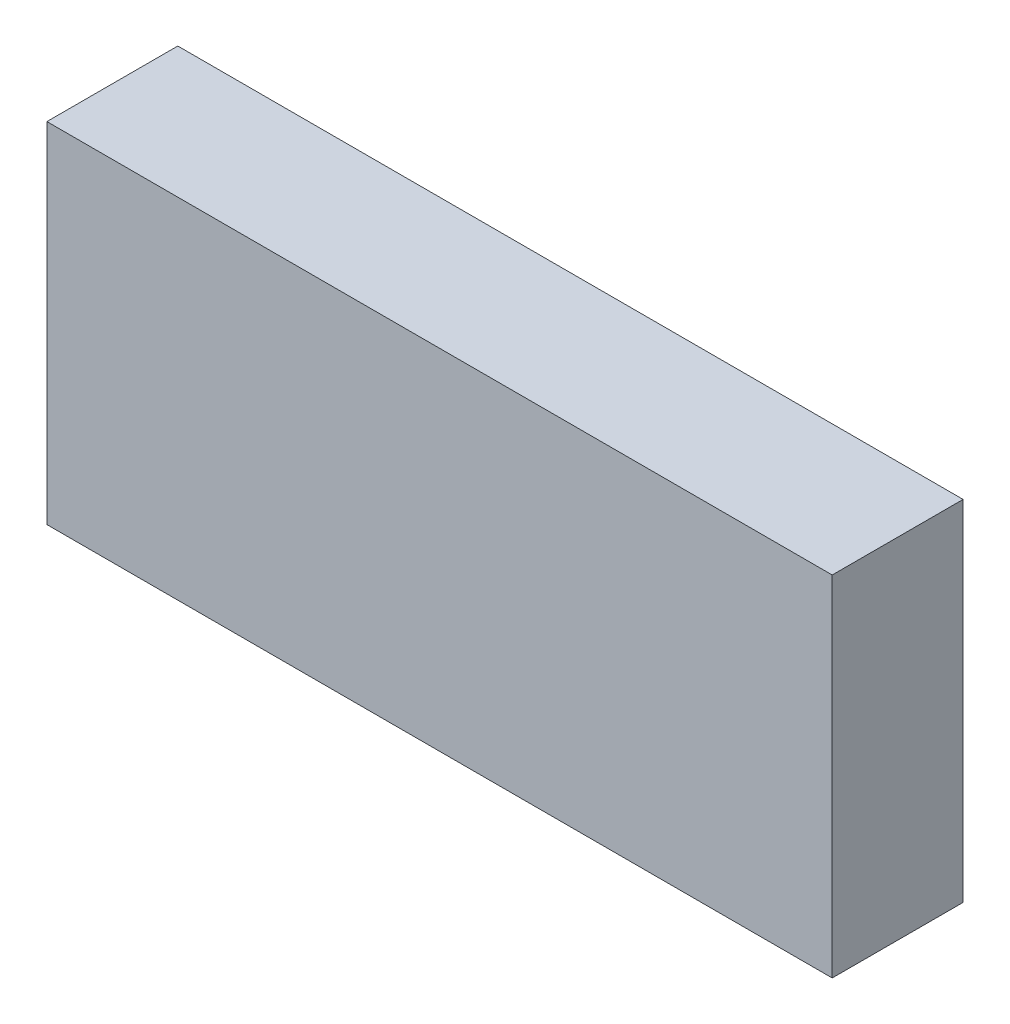
ISO-10303-21;
HEADER;
FILE_DESCRIPTION(('STEP AP214'),'2;1');
FILE_NAME('part.step','',(''),(''),'','','');
FILE_SCHEMA(('AUTOMOTIVE_DESIGN { 1 0 10303 214 1 1 1 1 }'));
ENDSEC;
DATA;
#1=APPLICATION_CONTEXT('core data for automotive mechanical design processes');
#2=APPLICATION_PROTOCOL_DEFINITION('international standard','automotive_design',2000,#1);
#3=PRODUCT_CONTEXT('',#1,'mechanical');
#4=PRODUCT('Part','Part','',(#3));
#5=PRODUCT_RELATED_PRODUCT_CATEGORY('part','',(#4));
#6=PRODUCT_DEFINITION_FORMATION('','',#4);
#7=PRODUCT_DEFINITION_CONTEXT('part definition',#1,'design');
#8=PRODUCT_DEFINITION('design','',#6,#7);
#9=PRODUCT_DEFINITION_SHAPE('','',#8);
#10=(LENGTH_UNIT() NAMED_UNIT(*) SI_UNIT(.MILLI.,.METRE.));
#11=(NAMED_UNIT(*) PLANE_ANGLE_UNIT() SI_UNIT($,.RADIAN.));
#12=(NAMED_UNIT(*) SI_UNIT($,.STERADIAN.) SOLID_ANGLE_UNIT());
#13=UNCERTAINTY_MEASURE_WITH_UNIT(LENGTH_MEASURE(1.E-05),#10,'distance_accuracy_value','');
#14=(GEOMETRIC_REPRESENTATION_CONTEXT(3) GLOBAL_UNCERTAINTY_ASSIGNED_CONTEXT((#13)) GLOBAL_UNIT_ASSIGNED_CONTEXT((#10,
#11,#12)) REPRESENTATION_CONTEXT('',''));
#15=CARTESIAN_POINT('',(0.,0.,0.));
#16=DIRECTION('',(0.,0.,1.));
#17=DIRECTION('',(1.,0.,0.));
#18=AXIS2_PLACEMENT_3D('',#15,#16,#17);
#19=CARTESIAN_POINT('',(0.,0.,150.));
#20=DIRECTION('',(1.,0.,0.));
#21=DIRECTION('',(0.,0.,-1.));
#22=AXIS2_PLACEMENT_3D('',#19,#20,#21);
#23=PLANE('',#22);
#24=DIRECTION('',(0.,-1.,0.));
#25=VECTOR('',#24,1.);
#26=CARTESIAN_POINT('',(0.,0.,0.));
#27=LINE('',#26,#25);
#28=CARTESIAN_POINT('',(0.,400.,0.));
#29=VERTEX_POINT('',#28);
#30=CARTESIAN_POINT('',(0.,0.,0.));
#31=VERTEX_POINT('',#30);
#32=EDGE_CURVE('E98',#29,#31,#27,.T.);
#33=ORIENTED_EDGE('',*,*,#32,.T.);
#34=DIRECTION('',(0.,0.,-1.));
#35=VECTOR('',#34,1.);
#36=CARTESIAN_POINT('',(0.,0.,150.));
#37=LINE('',#36,#35);
#38=CARTESIAN_POINT('',(0.,0.,150.));
#39=VERTEX_POINT('',#38);
#40=EDGE_CURVE('E11',#39,#31,#37,.T.);
#41=ORIENTED_EDGE('',*,*,#40,.F.);
#42=DIRECTION('',(0.,-1.,0.));
#43=VECTOR('',#42,1.);
#44=CARTESIAN_POINT('',(0.,0.,150.));
#45=LINE('',#44,#43);
#46=CARTESIAN_POINT('',(0.,400.,150.));
#47=VERTEX_POINT('',#46);
#48=EDGE_CURVE('E86',#47,#39,#45,.T.);
#49=ORIENTED_EDGE('',*,*,#48,.F.);
#50=DIRECTION('',(0.,0.,-1.));
#51=VECTOR('',#50,1.);
#52=CARTESIAN_POINT('',(0.,400.,150.));
#53=LINE('',#52,#51);
#54=EDGE_CURVE('E94',#47,#29,#53,.T.);
#55=ORIENTED_EDGE('',*,*,#54,.T.);
#56=EDGE_LOOP('',(#33,#41,#49,#55));
#57=FACE_BOUND('',#56,.T.);
#58=ADVANCED_FACE('F35',(#57),#23,.F.);
#59=CARTESIAN_POINT('',(0.,0.,150.));
#60=DIRECTION('',(0.,1.,0.));
#61=DIRECTION('',(0.,0.,1.));
#62=AXIS2_PLACEMENT_3D('',#59,#60,#61);
#63=PLANE('',#62);
#64=DIRECTION('',(1.,0.,0.));
#65=VECTOR('',#64,1.);
#66=CARTESIAN_POINT('',(0.,0.,0.));
#67=LINE('',#66,#65);
#68=CARTESIAN_POINT('',(900.,0.,0.));
#69=VERTEX_POINT('',#68);
#70=EDGE_CURVE('E90',#31,#69,#67,.T.);
#71=ORIENTED_EDGE('',*,*,#70,.T.);
#72=DIRECTION('',(0.,0.,-1.));
#73=VECTOR('',#72,1.);
#74=CARTESIAN_POINT('',(900.,0.,150.));
#75=LINE('',#74,#73);
#76=CARTESIAN_POINT('',(900.,0.,150.));
#77=VERTEX_POINT('',#76);
#78=EDGE_CURVE('E43',#77,#69,#75,.T.);
#79=ORIENTED_EDGE('',*,*,#78,.F.);
#80=DIRECTION('',(1.,0.,0.));
#81=VECTOR('',#80,1.);
#82=CARTESIAN_POINT('',(0.,0.,150.));
#83=LINE('',#82,#81);
#84=EDGE_CURVE('E81',#39,#77,#83,.T.);
#85=ORIENTED_EDGE('',*,*,#84,.F.);
#86=ORIENTED_EDGE('',*,*,#40,.T.);
#87=EDGE_LOOP('',(#71,#79,#85,#86));
#88=FACE_BOUND('',#87,.T.);
#89=ADVANCED_FACE('F89',(#88),#63,.F.);
#90=CARTESIAN_POINT('',(900.,0.,150.));
#91=DIRECTION('',(-1.,0.,0.));
#92=DIRECTION('',(0.,0.,1.));
#93=AXIS2_PLACEMENT_3D('',#90,#91,#92);
#94=PLANE('',#93);
#95=DIRECTION('',(0.,1.,0.));
#96=VECTOR('',#95,1.);
#97=CARTESIAN_POINT('',(900.,0.,0.));
#98=LINE('',#97,#96);
#99=CARTESIAN_POINT('',(900.,400.,0.));
#100=VERTEX_POINT('',#99);
#101=EDGE_CURVE('E68',#69,#100,#98,.T.);
#102=ORIENTED_EDGE('',*,*,#101,.T.);
#103=DIRECTION('',(0.,0.,-1.));
#104=VECTOR('',#103,1.);
#105=CARTESIAN_POINT('',(900.,400.,150.));
#106=LINE('',#105,#104);
#107=CARTESIAN_POINT('',(900.,400.,150.));
#108=VERTEX_POINT('',#107);
#109=EDGE_CURVE('E91',#108,#100,#106,.T.);
#110=ORIENTED_EDGE('',*,*,#109,.F.);
#111=DIRECTION('',(0.,1.,0.));
#112=VECTOR('',#111,1.);
#113=CARTESIAN_POINT('',(900.,0.,150.));
#114=LINE('',#113,#112);
#115=EDGE_CURVE('E84',#77,#108,#114,.T.);
#116=ORIENTED_EDGE('',*,*,#115,.F.);
#117=ORIENTED_EDGE('',*,*,#78,.T.);
#118=EDGE_LOOP('',(#102,#110,#116,#117));
#119=FACE_BOUND('',#118,.T.);
#120=ADVANCED_FACE('F92',(#119),#94,.F.);
#121=CARTESIAN_POINT('',(0.,400.,150.));
#122=DIRECTION('',(0.,-1.,0.));
#123=DIRECTION('',(0.,0.,-1.));
#124=AXIS2_PLACEMENT_3D('',#121,#122,#123);
#125=PLANE('',#124);
#126=DIRECTION('',(-1.,0.,0.));
#127=VECTOR('',#126,1.);
#128=CARTESIAN_POINT('',(0.,400.,0.));
#129=LINE('',#128,#127);
#130=EDGE_CURVE('E74',#100,#29,#129,.T.);
#131=ORIENTED_EDGE('',*,*,#130,.T.);
#132=ORIENTED_EDGE('',*,*,#54,.F.);
#133=DIRECTION('',(-1.,0.,0.));
#134=VECTOR('',#133,1.);
#135=CARTESIAN_POINT('',(0.,400.,150.));
#136=LINE('',#135,#134);
#137=EDGE_CURVE('E51',#108,#47,#136,.T.);
#138=ORIENTED_EDGE('',*,*,#137,.F.);
#139=ORIENTED_EDGE('',*,*,#109,.T.);
#140=EDGE_LOOP('',(#131,#132,#138,#139));
#141=FACE_BOUND('',#140,.T.);
#142=ADVANCED_FACE('F105',(#141),#125,.F.);
#143=CARTESIAN_POINT('',(0.,0.,150.));
#144=DIRECTION('',(0.,0.,-1.));
#145=DIRECTION('',(-1.,0.,0.));
#146=AXIS2_PLACEMENT_3D('',#143,#144,#145);
#147=PLANE('',#146);
#148=ORIENTED_EDGE('',*,*,#48,.T.);
#149=ORIENTED_EDGE('',*,*,#84,.T.);
#150=ORIENTED_EDGE('',*,*,#115,.T.);
#151=ORIENTED_EDGE('',*,*,#137,.T.);
#152=EDGE_LOOP('',(#148,#149,#150,#151));
#153=FACE_BOUND('',#152,.T.);
#154=ADVANCED_FACE('F82',(#153),#147,.F.);
#155=CARTESIAN_POINT('',(0.,0.,0.));
#156=DIRECTION('',(0.,0.,-1.));
#157=DIRECTION('',(-1.,0.,0.));
#158=AXIS2_PLACEMENT_3D('',#155,#156,#157);
#159=PLANE('',#158);
#160=ORIENTED_EDGE('',*,*,#32,.F.);
#161=ORIENTED_EDGE('',*,*,#130,.F.);
#162=ORIENTED_EDGE('',*,*,#101,.F.);
#163=ORIENTED_EDGE('',*,*,#70,.F.);
#164=EDGE_LOOP('',(#160,#161,#162,#163));
#165=FACE_BOUND('',#164,.T.);
#166=ADVANCED_FACE('F108',(#165),#159,.T.);
#167=CLOSED_SHELL('',(#58,#89,#120,#142,#154,#166));
#168=MANIFOLD_SOLID_BREP('B2',#167);
#169=ADVANCED_BREP_SHAPE_REPRESENTATION('',(#18,#168),#14);
#170=SHAPE_DEFINITION_REPRESENTATION(#9,#169);
ENDSEC;
END-ISO-10303-21;
